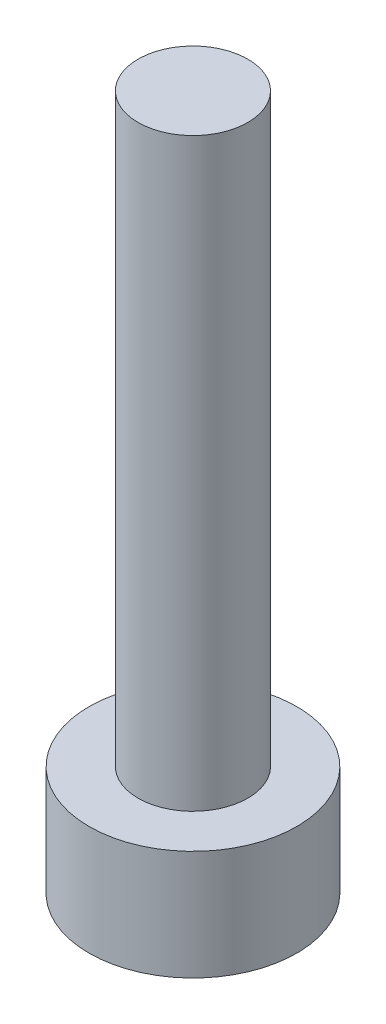
ISO-10303-21;
HEADER;
FILE_DESCRIPTION(('STEP AP214'),'2;1');
FILE_NAME('part.step','',(''),(''),'','','');
FILE_SCHEMA(('AUTOMOTIVE_DESIGN { 1 0 10303 214 1 1 1 1 }'));
ENDSEC;
DATA;
#1=APPLICATION_CONTEXT('core data for automotive mechanical design processes');
#2=APPLICATION_PROTOCOL_DEFINITION('international standard','automotive_design',2000,#1);
#3=PRODUCT_CONTEXT('',#1,'mechanical');
#4=PRODUCT('Part','Part','',(#3));
#5=PRODUCT_RELATED_PRODUCT_CATEGORY('part','',(#4));
#6=PRODUCT_DEFINITION_FORMATION('','',#4);
#7=PRODUCT_DEFINITION_CONTEXT('part definition',#1,'design');
#8=PRODUCT_DEFINITION('design','',#6,#7);
#9=PRODUCT_DEFINITION_SHAPE('','',#8);
#10=(LENGTH_UNIT() NAMED_UNIT(*) SI_UNIT(.MILLI.,.METRE.));
#11=(NAMED_UNIT(*) PLANE_ANGLE_UNIT() SI_UNIT($,.RADIAN.));
#12=(NAMED_UNIT(*) SI_UNIT($,.STERADIAN.) SOLID_ANGLE_UNIT());
#13=UNCERTAINTY_MEASURE_WITH_UNIT(LENGTH_MEASURE(1.E-05),#10,'distance_accuracy_value','');
#14=(GEOMETRIC_REPRESENTATION_CONTEXT(3) GLOBAL_UNCERTAINTY_ASSIGNED_CONTEXT((#13)) GLOBAL_UNIT_ASSIGNED_CONTEXT((#10,
#11,#12)) REPRESENTATION_CONTEXT('',''));
#15=CARTESIAN_POINT('',(0.,0.,0.));
#16=DIRECTION('',(0.,0.,1.));
#17=DIRECTION('',(1.,0.,0.));
#18=AXIS2_PLACEMENT_3D('',#15,#16,#17);
#19=CARTESIAN_POINT('',(0.,3.,0.));
#20=DIRECTION('',(0.,-1.,0.));
#21=DIRECTION('',(0.,0.,-1.));
#22=AXIS2_PLACEMENT_3D('',#19,#20,#21);
#23=CYLINDRICAL_SURFACE('',#22,2.84);
#24=CARTESIAN_POINT('',(0.,3.,0.));
#25=DIRECTION('',(0.,1.,0.));
#26=DIRECTION('',(0.,0.,1.));
#27=AXIS2_PLACEMENT_3D('',#24,#25,#26);
#28=CIRCLE('',#27,2.84);
#29=CARTESIAN_POINT('',(0.,3.,2.84));
#30=VERTEX_POINT('',#29);
#31=EDGE_CURVE('E45',#30,#30,#28,.T.);
#32=ORIENTED_EDGE('',*,*,#31,.F.);
#33=EDGE_LOOP('',(#32));
#34=FACE_BOUND('',#33,.T.);
#35=CARTESIAN_POINT('',(0.,0.,0.));
#36=DIRECTION('',(0.,1.,0.));
#37=DIRECTION('',(0.,0.,1.));
#38=AXIS2_PLACEMENT_3D('',#35,#36,#37);
#39=CIRCLE('',#38,2.84);
#40=CARTESIAN_POINT('',(0.,0.,2.84));
#41=VERTEX_POINT('',#40);
#42=EDGE_CURVE('E40',#41,#41,#39,.T.);
#43=ORIENTED_EDGE('',*,*,#42,.T.);
#44=EDGE_LOOP('',(#43));
#45=FACE_BOUND('',#44,.T.);
#46=ADVANCED_FACE('F37',(#34,#45),#23,.T.);
#47=CARTESIAN_POINT('',(0.,3.,0.));
#48=DIRECTION('',(0.,1.,0.));
#49=DIRECTION('',(0.,0.,1.));
#50=AXIS2_PLACEMENT_3D('',#47,#48,#49);
#51=PLANE('',#50);
#52=CARTESIAN_POINT('',(0.,3.,0.));
#53=DIRECTION('',(0.,1.,0.));
#54=DIRECTION('',(0.,0.,1.));
#55=AXIS2_PLACEMENT_3D('',#52,#53,#54);
#56=CIRCLE('',#55,1.5);
#57=CARTESIAN_POINT('',(0.,3.,1.5));
#58=VERTEX_POINT('',#57);
#59=EDGE_CURVE('E11',#58,#58,#56,.T.);
#60=ORIENTED_EDGE('',*,*,#59,.F.);
#61=EDGE_LOOP('',(#60));
#62=FACE_BOUND('',#61,.T.);
#63=ORIENTED_EDGE('',*,*,#31,.T.);
#64=EDGE_LOOP('',(#63));
#65=FACE_BOUND('',#64,.T.);
#66=ADVANCED_FACE('F157',(#62,#65),#51,.T.);
#67=CARTESIAN_POINT('',(0.,0.,0.));
#68=DIRECTION('',(0.,1.,0.));
#69=DIRECTION('',(0.,0.,1.));
#70=AXIS2_PLACEMENT_3D('',#67,#68,#69);
#71=PLANE('',#70);
#72=DIRECTION('',(-1.,0.,0.));
#73=VECTOR('',#72,1.);
#74=CARTESIAN_POINT('',(0.744781847254617,0.,1.29));
#75=LINE('',#74,#73);
#76=CARTESIAN_POINT('',(0.744781847254617,0.,1.29));
#77=VERTEX_POINT('',#76);
#78=CARTESIAN_POINT('',(-0.744781847254617,0.,1.29));
#79=VERTEX_POINT('',#78);
#80=EDGE_CURVE('E127',#77,#79,#75,.T.);
#81=ORIENTED_EDGE('',*,*,#80,.F.);
#82=DIRECTION('',(-0.5,0.,0.866025403784439));
#83=VECTOR('',#82,1.);
#84=CARTESIAN_POINT('',(1.48956369450923,0.,0.));
#85=LINE('',#84,#83);
#86=CARTESIAN_POINT('',(1.48956369450923,0.,0.));
#87=VERTEX_POINT('',#86);
#88=EDGE_CURVE('E53',#87,#77,#85,.T.);
#89=ORIENTED_EDGE('',*,*,#88,.F.);
#90=DIRECTION('',(0.5,0.,0.866025403784439));
#91=VECTOR('',#90,1.);
#92=CARTESIAN_POINT('',(0.744781847254617,0.,-1.29));
#93=LINE('',#92,#91);
#94=CARTESIAN_POINT('',(0.744781847254617,0.,-1.29));
#95=VERTEX_POINT('',#94);
#96=EDGE_CURVE('E136',#95,#87,#93,.T.);
#97=ORIENTED_EDGE('',*,*,#96,.F.);
#98=DIRECTION('',(1.,0.,0.));
#99=VECTOR('',#98,1.);
#100=CARTESIAN_POINT('',(-0.744781847254617,0.,-1.29));
#101=LINE('',#100,#99);
#102=CARTESIAN_POINT('',(-0.744781847254617,0.,-1.29));
#103=VERTEX_POINT('',#102);
#104=EDGE_CURVE('E134',#103,#95,#101,.T.);
#105=ORIENTED_EDGE('',*,*,#104,.F.);
#106=DIRECTION('',(0.5,0.,-0.866025403784439));
#107=VECTOR('',#106,1.);
#108=CARTESIAN_POINT('',(-1.48956369450923,0.,0.));
#109=LINE('',#108,#107);
#110=CARTESIAN_POINT('',(-1.48956369450923,0.,0.));
#111=VERTEX_POINT('',#110);
#112=EDGE_CURVE('E101',#111,#103,#109,.T.);
#113=ORIENTED_EDGE('',*,*,#112,.F.);
#114=DIRECTION('',(-0.5,0.,-0.866025403784439));
#115=VECTOR('',#114,1.);
#116=CARTESIAN_POINT('',(-0.744781847254617,0.,1.29));
#117=LINE('',#116,#115);
#118=EDGE_CURVE('E130',#79,#111,#117,.T.);
#119=ORIENTED_EDGE('',*,*,#118,.F.);
#120=EDGE_LOOP('',(#81,#89,#97,#105,#113,#119));
#121=FACE_BOUND('',#120,.T.);
#122=ORIENTED_EDGE('',*,*,#42,.F.);
#123=EDGE_LOOP('',(#122));
#124=FACE_BOUND('',#123,.T.);
#125=ADVANCED_FACE('F154',(#121,#124),#71,.F.);
#126=CARTESIAN_POINT('',(0.,19.,0.));
#127=DIRECTION('',(0.,-1.,0.));
#128=DIRECTION('',(0.,0.,-1.));
#129=AXIS2_PLACEMENT_3D('',#126,#127,#128);
#130=CYLINDRICAL_SURFACE('',#129,1.5);
#131=CARTESIAN_POINT('',(0.,19.,0.));
#132=DIRECTION('',(0.,1.,0.));
#133=DIRECTION('',(0.,0.,1.));
#134=AXIS2_PLACEMENT_3D('',#131,#132,#133);
#135=CIRCLE('',#134,1.5);
#136=CARTESIAN_POINT('',(0.,19.,1.5));
#137=VERTEX_POINT('',#136);
#138=EDGE_CURVE('E140',#137,#137,#135,.T.);
#139=ORIENTED_EDGE('',*,*,#138,.F.);
#140=EDGE_LOOP('',(#139));
#141=FACE_BOUND('',#140,.T.);
#142=ORIENTED_EDGE('',*,*,#59,.T.);
#143=EDGE_LOOP('',(#142));
#144=FACE_BOUND('',#143,.T.);
#145=ADVANCED_FACE('F156',(#141,#144),#130,.T.);
#146=CARTESIAN_POINT('',(0.,19.,0.));
#147=DIRECTION('',(0.,1.,0.));
#148=DIRECTION('',(0.,0.,1.));
#149=AXIS2_PLACEMENT_3D('',#146,#147,#148);
#150=PLANE('',#149);
#151=ORIENTED_EDGE('',*,*,#138,.T.);
#152=EDGE_LOOP('',(#151));
#153=FACE_BOUND('',#152,.T.);
#154=ADVANCED_FACE('F163',(#153),#150,.T.);
#155=CARTESIAN_POINT('',(1.48956369450923,1.3,0.));
#156=DIRECTION('',(0.866025403784439,0.,0.5));
#157=DIRECTION('',(0.5,0.,-0.866025403784439));
#158=AXIS2_PLACEMENT_3D('',#155,#156,#157);
#159=PLANE('',#158);
#160=ORIENTED_EDGE('',*,*,#88,.T.);
#161=DIRECTION('',(0.,-1.,0.));
#162=VECTOR('',#161,1.);
#163=CARTESIAN_POINT('',(0.744781847254617,1.3,1.29));
#164=LINE('',#163,#162);
#165=CARTESIAN_POINT('',(0.744781847254617,1.3,1.29));
#166=VERTEX_POINT('',#165);
#167=EDGE_CURVE('E83',#166,#77,#164,.T.);
#168=ORIENTED_EDGE('',*,*,#167,.F.);
#169=DIRECTION('',(-0.5,0.,0.866025403784439));
#170=VECTOR('',#169,1.);
#171=CARTESIAN_POINT('',(1.48956369450923,1.3,0.));
#172=LINE('',#171,#170);
#173=CARTESIAN_POINT('',(1.48956369450923,1.3,0.));
#174=VERTEX_POINT('',#173);
#175=EDGE_CURVE('E138',#174,#166,#172,.T.);
#176=ORIENTED_EDGE('',*,*,#175,.F.);
#177=DIRECTION('',(0.,-1.,0.));
#178=VECTOR('',#177,1.);
#179=CARTESIAN_POINT('',(1.48956369450923,1.3,0.));
#180=LINE('',#179,#178);
#181=EDGE_CURVE('E61',#174,#87,#180,.T.);
#182=ORIENTED_EDGE('',*,*,#181,.T.);
#183=EDGE_LOOP('',(#160,#168,#176,#182));
#184=FACE_BOUND('',#183,.T.);
#185=ADVANCED_FACE('F192',(#184),#159,.F.);
#186=CARTESIAN_POINT('',(0.744781847254617,1.3,-1.29));
#187=DIRECTION('',(0.866025403784439,0.,-0.5));
#188=DIRECTION('',(-0.5,0.,-0.866025403784439));
#189=AXIS2_PLACEMENT_3D('',#186,#187,#188);
#190=PLANE('',#189);
#191=ORIENTED_EDGE('',*,*,#96,.T.);
#192=ORIENTED_EDGE('',*,*,#181,.F.);
#193=DIRECTION('',(0.5,0.,0.866025403784439));
#194=VECTOR('',#193,1.);
#195=CARTESIAN_POINT('',(0.744781847254617,1.3,-1.29));
#196=LINE('',#195,#194);
#197=CARTESIAN_POINT('',(0.744781847254617,1.3,-1.29));
#198=VERTEX_POINT('',#197);
#199=EDGE_CURVE('E113',#198,#174,#196,.T.);
#200=ORIENTED_EDGE('',*,*,#199,.F.);
#201=DIRECTION('',(0.,-1.,0.));
#202=VECTOR('',#201,1.);
#203=CARTESIAN_POINT('',(0.744781847254617,1.3,-1.29));
#204=LINE('',#203,#202);
#205=EDGE_CURVE('E105',#198,#95,#204,.T.);
#206=ORIENTED_EDGE('',*,*,#205,.T.);
#207=EDGE_LOOP('',(#191,#192,#200,#206));
#208=FACE_BOUND('',#207,.T.);
#209=ADVANCED_FACE('F206',(#208),#190,.F.);
#210=CARTESIAN_POINT('',(-0.744781847254617,1.3,-1.29));
#211=DIRECTION('',(0.,0.,-1.));
#212=DIRECTION('',(-1.,0.,0.));
#213=AXIS2_PLACEMENT_3D('',#210,#211,#212);
#214=PLANE('',#213);
#215=ORIENTED_EDGE('',*,*,#104,.T.);
#216=ORIENTED_EDGE('',*,*,#205,.F.);
#217=DIRECTION('',(1.,0.,0.));
#218=VECTOR('',#217,1.);
#219=CARTESIAN_POINT('',(-0.744781847254617,1.3,-1.29));
#220=LINE('',#219,#218);
#221=CARTESIAN_POINT('',(-0.744781847254617,1.3,-1.29));
#222=VERTEX_POINT('',#221);
#223=EDGE_CURVE('E109',#222,#198,#220,.T.);
#224=ORIENTED_EDGE('',*,*,#223,.F.);
#225=DIRECTION('',(0.,-1.,0.));
#226=VECTOR('',#225,1.);
#227=CARTESIAN_POINT('',(-0.744781847254617,1.3,-1.29));
#228=LINE('',#227,#226);
#229=EDGE_CURVE('E94',#222,#103,#228,.T.);
#230=ORIENTED_EDGE('',*,*,#229,.T.);
#231=EDGE_LOOP('',(#215,#216,#224,#230));
#232=FACE_BOUND('',#231,.T.);
#233=ADVANCED_FACE('F110',(#232),#214,.F.);
#234=CARTESIAN_POINT('',(-1.48956369450923,1.3,0.));
#235=DIRECTION('',(-0.866025403784439,0.,-0.5));
#236=DIRECTION('',(-0.5,0.,0.866025403784439));
#237=AXIS2_PLACEMENT_3D('',#234,#235,#236);
#238=PLANE('',#237);
#239=ORIENTED_EDGE('',*,*,#112,.T.);
#240=ORIENTED_EDGE('',*,*,#229,.F.);
#241=DIRECTION('',(0.5,0.,-0.866025403784439));
#242=VECTOR('',#241,1.);
#243=CARTESIAN_POINT('',(-1.48956369450923,1.3,0.));
#244=LINE('',#243,#242);
#245=CARTESIAN_POINT('',(-1.48956369450923,1.3,0.));
#246=VERTEX_POINT('',#245);
#247=EDGE_CURVE('E98',#246,#222,#244,.T.);
#248=ORIENTED_EDGE('',*,*,#247,.F.);
#249=DIRECTION('',(0.,-1.,0.));
#250=VECTOR('',#249,1.);
#251=CARTESIAN_POINT('',(-1.48956369450923,1.3,0.));
#252=LINE('',#251,#250);
#253=EDGE_CURVE('E106',#246,#111,#252,.T.);
#254=ORIENTED_EDGE('',*,*,#253,.T.);
#255=EDGE_LOOP('',(#239,#240,#248,#254));
#256=FACE_BOUND('',#255,.T.);
#257=ADVANCED_FACE('F96',(#256),#238,.F.);
#258=CARTESIAN_POINT('',(-0.744781847254617,1.3,1.29));
#259=DIRECTION('',(-0.866025403784439,0.,0.5));
#260=DIRECTION('',(0.5,0.,0.866025403784439));
#261=AXIS2_PLACEMENT_3D('',#258,#259,#260);
#262=PLANE('',#261);
#263=ORIENTED_EDGE('',*,*,#118,.T.);
#264=ORIENTED_EDGE('',*,*,#253,.F.);
#265=DIRECTION('',(-0.5,0.,-0.866025403784439));
#266=VECTOR('',#265,1.);
#267=CARTESIAN_POINT('',(-0.744781847254617,1.3,1.29));
#268=LINE('',#267,#266);
#269=CARTESIAN_POINT('',(-0.744781847254617,1.3,1.29));
#270=VERTEX_POINT('',#269);
#271=EDGE_CURVE('E119',#270,#246,#268,.T.);
#272=ORIENTED_EDGE('',*,*,#271,.F.);
#273=DIRECTION('',(0.,-1.,0.));
#274=VECTOR('',#273,1.);
#275=CARTESIAN_POINT('',(-0.744781847254617,1.3,1.29));
#276=LINE('',#275,#274);
#277=EDGE_CURVE('E143',#270,#79,#276,.T.);
#278=ORIENTED_EDGE('',*,*,#277,.T.);
#279=EDGE_LOOP('',(#263,#264,#272,#278));
#280=FACE_BOUND('',#279,.T.);
#281=ADVANCED_FACE('F231',(#280),#262,.F.);
#282=CARTESIAN_POINT('',(0.744781847254617,1.3,1.29));
#283=DIRECTION('',(0.,0.,1.));
#284=DIRECTION('',(1.,0.,0.));
#285=AXIS2_PLACEMENT_3D('',#282,#283,#284);
#286=PLANE('',#285);
#287=ORIENTED_EDGE('',*,*,#80,.T.);
#288=ORIENTED_EDGE('',*,*,#277,.F.);
#289=DIRECTION('',(-1.,0.,0.));
#290=VECTOR('',#289,1.);
#291=CARTESIAN_POINT('',(0.744781847254617,1.3,1.29));
#292=LINE('',#291,#290);
#293=EDGE_CURVE('E121',#166,#270,#292,.T.);
#294=ORIENTED_EDGE('',*,*,#293,.F.);
#295=ORIENTED_EDGE('',*,*,#167,.T.);
#296=EDGE_LOOP('',(#287,#288,#294,#295));
#297=FACE_BOUND('',#296,.T.);
#298=ADVANCED_FACE('F240',(#297),#286,.F.);
#299=CARTESIAN_POINT('',(0.,1.3,0.));
#300=DIRECTION('',(0.,-1.,0.));
#301=DIRECTION('',(0.,0.,-1.));
#302=AXIS2_PLACEMENT_3D('',#299,#300,#301);
#303=PLANE('',#302);
#304=ORIENTED_EDGE('',*,*,#175,.T.);
#305=ORIENTED_EDGE('',*,*,#293,.T.);
#306=ORIENTED_EDGE('',*,*,#271,.T.);
#307=ORIENTED_EDGE('',*,*,#247,.T.);
#308=ORIENTED_EDGE('',*,*,#223,.T.);
#309=ORIENTED_EDGE('',*,*,#199,.T.);
#310=EDGE_LOOP('',(#304,#305,#306,#307,#308,#309));
#311=FACE_BOUND('',#310,.T.);
#312=ADVANCED_FACE('F116',(#311),#303,.T.);
#313=CLOSED_SHELL('',(#46,#66,#125,#145,#154,#185,#209,#233,#257,#281,#298,#312));
#314=MANIFOLD_SOLID_BREP('B2',#313);
#315=ADVANCED_BREP_SHAPE_REPRESENTATION('',(#18,#314),#14);
#316=SHAPE_DEFINITION_REPRESENTATION(#9,#315);
ENDSEC;
END-ISO-10303-21;
